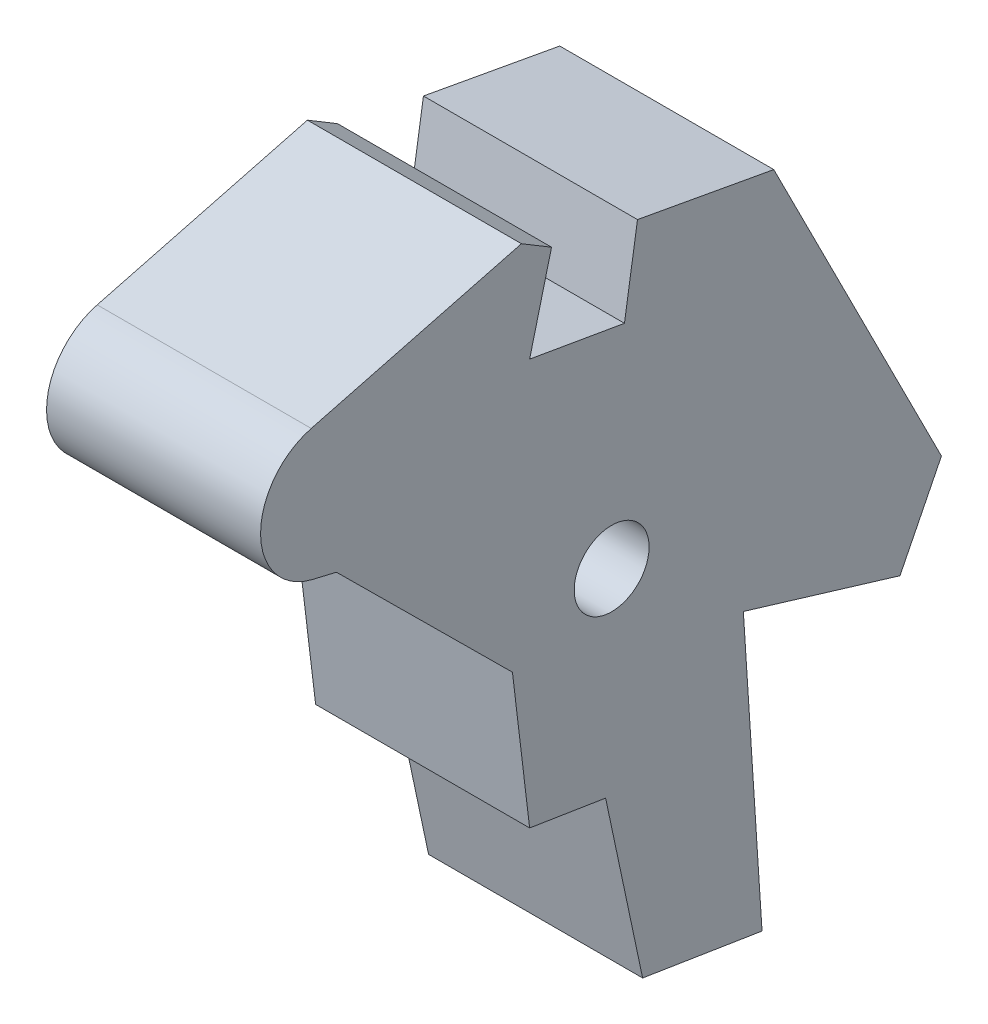
ISO-10303-21;
HEADER;
FILE_DESCRIPTION(('STEP AP214'),'2;1');
FILE_NAME('part.step','',(''),(''),'','','');
FILE_SCHEMA(('AUTOMOTIVE_DESIGN { 1 0 10303 214 1 1 1 1 }'));
ENDSEC;
DATA;
#1=APPLICATION_CONTEXT('core data for automotive mechanical design processes');
#2=APPLICATION_PROTOCOL_DEFINITION('international standard','automotive_design',2000,#1);
#3=PRODUCT_CONTEXT('',#1,'mechanical');
#4=PRODUCT('Part','Part','',(#3));
#5=PRODUCT_RELATED_PRODUCT_CATEGORY('part','',(#4));
#6=PRODUCT_DEFINITION_FORMATION('','',#4);
#7=PRODUCT_DEFINITION_CONTEXT('part definition',#1,'design');
#8=PRODUCT_DEFINITION('design','',#6,#7);
#9=PRODUCT_DEFINITION_SHAPE('','',#8);
#10=(LENGTH_UNIT() NAMED_UNIT(*) SI_UNIT(.MILLI.,.METRE.));
#11=(NAMED_UNIT(*) PLANE_ANGLE_UNIT() SI_UNIT($,.RADIAN.));
#12=(NAMED_UNIT(*) SI_UNIT($,.STERADIAN.) SOLID_ANGLE_UNIT());
#13=UNCERTAINTY_MEASURE_WITH_UNIT(LENGTH_MEASURE(1.E-05),#10,'distance_accuracy_value','');
#14=(GEOMETRIC_REPRESENTATION_CONTEXT(3) GLOBAL_UNCERTAINTY_ASSIGNED_CONTEXT((#13)) GLOBAL_UNIT_ASSIGNED_CONTEXT((#10,
#11,#12)) REPRESENTATION_CONTEXT('',''));
#15=CARTESIAN_POINT('',(0.,0.,0.));
#16=DIRECTION('',(0.,0.,1.));
#17=DIRECTION('',(1.,0.,0.));
#18=AXIS2_PLACEMENT_3D('',#15,#16,#17);
#19=CARTESIAN_POINT('',(6.,11.5482949787272,15.8837198712041));
#20=DIRECTION('',(1.,0.,0.));
#21=DIRECTION('',(0.,0.,-1.));
#22=AXIS2_PLACEMENT_3D('',#19,#20,#21);
#23=PLANE('',#22);
#24=CARTESIAN_POINT('',(6.,11.5482949787272,15.8837198712041));
#25=DIRECTION('',(1.,0.,0.));
#26=DIRECTION('',(0.,0.,-1.));
#27=AXIS2_PLACEMENT_3D('',#24,#25,#26);
#28=CIRCLE('',#27,3.8);
#29=CARTESIAN_POINT('',(6.,15.2250597478379,16.8436161325918));
#30=VERTEX_POINT('',#29);
#31=CARTESIAN_POINT('',(6.,7.84966433834525,16.7555750117106));
#32=VERTEX_POINT('',#31);
#33=EDGE_CURVE('E217',#30,#32,#28,.T.);
#34=ORIENTED_EDGE('',*,*,#33,.T.);
#35=DIRECTION('',(0.,-0.229435563291186,-0.973323852732099));
#36=VECTOR('',#35,1.);
#37=CARTESIAN_POINT('',(6.,7.84966433834525,16.7555750117106));
#38=LINE('',#37,#36);
#39=CARTESIAN_POINT('',(6.,7.53780659305625,15.4325953576636));
#40=VERTEX_POINT('',#39);
#41=EDGE_CURVE('E120',#32,#40,#38,.T.);
#42=ORIENTED_EDGE('',*,*,#41,.T.);
#43=DIRECTION('',(0.,-0.704199146911368,-0.710002508086628));
#44=VECTOR('',#43,1.);
#45=CARTESIAN_POINT('',(6.,7.53780659305625,15.4325953576636));
#46=LINE('',#45,#44);
#47=CARTESIAN_POINT('',(6.,-2.25101302616688,5.56310529744524));
#48=VERTEX_POINT('',#47);
#49=EDGE_CURVE('E259',#40,#48,#46,.T.);
#50=ORIENTED_EDGE('',*,*,#49,.T.);
#51=DIRECTION('',(0.,-0.992896070385912,-0.118984845304827));
#52=VECTOR('',#51,1.);
#53=CARTESIAN_POINT('',(6.,-2.25101302616688,5.56310529744524));
#54=LINE('',#53,#52);
#55=CARTESIAN_POINT('',(6.,-10.2975694173018,4.59883693543668));
#56=VERTEX_POINT('',#55);
#57=EDGE_CURVE('E278',#48,#56,#54,.T.);
#58=ORIENTED_EDGE('',*,*,#57,.T.);
#59=DIRECTION('',(0.,-0.157580761137786,-0.987506103130121));
#60=VECTOR('',#59,1.);
#61=CARTESIAN_POINT('',(6.,-10.2975694173018,4.59883693543668));
#62=LINE('',#61,#60);
#63=CARTESIAN_POINT('',(6.,-10.9774025682372,0.338549189574812));
#64=VERTEX_POINT('',#63);
#65=EDGE_CURVE('E275',#56,#64,#62,.T.);
#66=ORIENTED_EDGE('',*,*,#65,.T.);
#67=DIRECTION('',(0.,-0.978180845730438,-0.207755223871951));
#68=VECTOR('',#67,1.);
#69=CARTESIAN_POINT('',(6.,-10.9774025682372,0.338549189574812));
#70=LINE('',#69,#68);
#71=CARTESIAN_POINT('',(6.,-20.7506842257561,-1.73719204742035));
#72=VERTEX_POINT('',#71);
#73=EDGE_CURVE('E277',#64,#72,#70,.T.);
#74=ORIENTED_EDGE('',*,*,#73,.T.);
#75=DIRECTION('',(0.,-0.157580761137786,-0.98750610313012));
#76=VECTOR('',#75,1.);
#77=CARTESIAN_POINT('',(6.,-20.7506842257561,-1.73719204742035));
#78=LINE('',#77,#76);
#79=CARTESIAN_POINT('',(6.,-21.8189770940916,-8.43182735565568));
#80=VERTEX_POINT('',#79);
#81=EDGE_CURVE('E280',#72,#80,#78,.T.);
#82=ORIENTED_EDGE('',*,*,#81,.T.);
#83=DIRECTION('',(0.,0.997870415721973,0.0652275511333734));
#84=VECTOR('',#83,1.);
#85=CARTESIAN_POINT('',(6.,-21.8189770940916,-8.43182735565568));
#86=LINE('',#85,#84);
#87=CARTESIAN_POINT('',(6.,-5.77780276998713,-7.38326784133453));
#88=VERTEX_POINT('',#87);
#89=EDGE_CURVE('E286',#80,#88,#86,.T.);
#90=ORIENTED_EDGE('',*,*,#89,.T.);
#91=DIRECTION('',(0.,-0.289389501276324,-0.957211427298609));
#92=VECTOR('',#91,1.);
#93=CARTESIAN_POINT('',(6.,-5.77780276998713,-7.38326784133453));
#94=LINE('',#93,#92);
#95=CARTESIAN_POINT('',(6.,-8.43294422336665,-16.1656588025129));
#96=VERTEX_POINT('',#95);
#97=EDGE_CURVE('E288',#88,#96,#94,.T.);
#98=ORIENTED_EDGE('',*,*,#97,.T.);
#99=DIRECTION('',(0.,0.894427190999914,-0.447213595499961));
#100=VECTOR('',#99,1.);
#101=CARTESIAN_POINT('',(6.,-8.43294422336665,-16.1656588025129));
#102=LINE('',#101,#100);
#103=CARTESIAN_POINT('',(6.,-3.78275455297007,-18.4907536377112));
#104=VERTEX_POINT('',#103);
#105=EDGE_CURVE('E290',#96,#104,#102,.T.);
#106=ORIENTED_EDGE('',*,*,#105,.T.);
#107=DIRECTION('',(0.,0.892585662901264,0.450877848627663));
#108=VECTOR('',#107,1.);
#109=CARTESIAN_POINT('',(6.,14.8272375378383,-9.09016213637799));
#110=LINE('',#109,#108);
#111=CARTESIAN_POINT('',(6.,14.8272375378383,-9.09016213637799));
#112=VERTEX_POINT('',#111);
#113=EDGE_CURVE('E292',#104,#112,#110,.T.);
#114=ORIENTED_EDGE('',*,*,#113,.T.);
#115=DIRECTION('',(0.,0.179313157800738,0.98379204684706));
#116=VECTOR('',#115,1.);
#117=CARTESIAN_POINT('',(6.,16.2201449465328,-1.44805016046392));
#118=LINE('',#117,#116);
#119=CARTESIAN_POINT('',(6.,16.2201449465328,-1.44805016046392));
#120=VERTEX_POINT('',#119);
#121=EDGE_CURVE('E294',#112,#120,#118,.T.);
#122=ORIENTED_EDGE('',*,*,#121,.T.);
#123=DIRECTION('',(0.,-0.988036947940971,0.154217345015048));
#124=VECTOR('',#123,1.);
#125=CARTESIAN_POINT('',(6.,11.5482949787272,-0.718846359082742));
#126=LINE('',#125,#124);
#127=CARTESIAN_POINT('',(6.,11.5482949787272,-0.718846359082742));
#128=VERTEX_POINT('',#127);
#129=EDGE_CURVE('E296',#120,#128,#126,.T.);
#130=ORIENTED_EDGE('',*,*,#129,.T.);
#131=DIRECTION('',(0.,0.170199910900748,0.985409554616444));
#132=VECTOR('',#131,1.);
#133=CARTESIAN_POINT('',(6.,11.5482949787272,-0.718846359082742));
#134=LINE('',#133,#132);
#135=CARTESIAN_POINT('',(6.,12.4667650896426,4.59883693543668));
#136=VERTEX_POINT('',#135);
#137=EDGE_CURVE('E166',#128,#136,#134,.T.);
#138=ORIENTED_EDGE('',*,*,#137,.T.);
#139=DIRECTION('',(0.,0.969015390372987,-0.247000350648106));
#140=VECTOR('',#139,1.);
#141=CARTESIAN_POINT('',(6.,17.2874663476256,3.37004850449828));
#142=LINE('',#141,#140);
#143=CARTESIAN_POINT('',(6.,17.2874663476256,3.37004850449828));
#144=VERTEX_POINT('',#143);
#145=EDGE_CURVE('E160',#136,#144,#142,.T.);
#146=ORIENTED_EDGE('',*,*,#145,.T.);
#147=DIRECTION('',(0.,0.515048017006709,0.857161326809287));
#148=VECTOR('',#147,1.);
#149=CARTESIAN_POINT('',(6.,17.2874663476256,3.37004850449828));
#150=LINE('',#149,#148);
#151=CARTESIAN_POINT('',(6.,18.3018730775652,5.05826045726451));
#152=VERTEX_POINT('',#151);
#153=EDGE_CURVE('E164',#144,#152,#150,.T.);
#154=ORIENTED_EDGE('',*,*,#153,.T.);
#155=DIRECTION('',(0.,-0.252604279312563,0.96756967608177));
#156=VECTOR('',#155,1.);
#157=CARTESIAN_POINT('',(6.,15.2250597478379,16.8436161325918));
#158=LINE('',#157,#156);
#159=EDGE_CURVE('E50',#152,#30,#158,.T.);
#160=ORIENTED_EDGE('',*,*,#159,.T.);
#161=EDGE_LOOP('',(#34,#42,#50,#58,#66,#74,#82,#90,#98,#106,#114,#122,#130,#138,#146,#154,#160));
#162=FACE_BOUND('',#161,.T.);
#163=CARTESIAN_POINT('',(6.,0.,0.));
#164=DIRECTION('',(1.,0.,0.));
#165=DIRECTION('',(0.,0.,-1.));
#166=AXIS2_PLACEMENT_3D('',#163,#164,#165);
#167=CIRCLE('',#166,2.1);
#168=CARTESIAN_POINT('',(6.,0.,-2.1));
#169=VERTEX_POINT('',#168);
#170=EDGE_CURVE('E188',#169,#169,#167,.T.);
#171=ORIENTED_EDGE('',*,*,#170,.F.);
#172=EDGE_LOOP('',(#171));
#173=FACE_BOUND('',#172,.T.);
#174=ADVANCED_FACE('F33',(#162,#173),#23,.T.);
#175=CARTESIAN_POINT('',(-6.,11.5482949787272,15.8837198712041));
#176=DIRECTION('',(1.,0.,0.));
#177=DIRECTION('',(0.,0.,-1.));
#178=AXIS2_PLACEMENT_3D('',#175,#176,#177);
#179=PLANE('',#178);
#180=CARTESIAN_POINT('',(-6.,11.5482949787272,15.8837198712041));
#181=DIRECTION('',(1.,0.,0.));
#182=DIRECTION('',(0.,0.,-1.));
#183=AXIS2_PLACEMENT_3D('',#180,#181,#182);
#184=CIRCLE('',#183,3.8);
#185=CARTESIAN_POINT('',(-6.,15.2250597478379,16.8436161325918));
#186=VERTEX_POINT('',#185);
#187=CARTESIAN_POINT('',(-6.,7.84966433834525,16.7555750117106));
#188=VERTEX_POINT('',#187);
#189=EDGE_CURVE('E184',#186,#188,#184,.T.);
#190=ORIENTED_EDGE('',*,*,#189,.F.);
#191=DIRECTION('',(0.,-0.252604279312563,0.96756967608177));
#192=VECTOR('',#191,1.);
#193=CARTESIAN_POINT('',(-6.,15.2250597478379,16.8436161325918));
#194=LINE('',#193,#192);
#195=CARTESIAN_POINT('',(-6.,18.3018730775652,5.05826045726451));
#196=VERTEX_POINT('',#195);
#197=EDGE_CURVE('E112',#196,#186,#194,.T.);
#198=ORIENTED_EDGE('',*,*,#197,.F.);
#199=DIRECTION('',(0.,0.515048017006709,0.857161326809287));
#200=VECTOR('',#199,1.);
#201=CARTESIAN_POINT('',(-6.,17.2874663476256,3.37004850449828));
#202=LINE('',#201,#200);
#203=CARTESIAN_POINT('',(-6.,17.2874663476256,3.37004850449828));
#204=VERTEX_POINT('',#203);
#205=EDGE_CURVE('E106',#204,#196,#202,.T.);
#206=ORIENTED_EDGE('',*,*,#205,.F.);
#207=DIRECTION('',(0.,0.969015390372987,-0.247000350648106));
#208=VECTOR('',#207,1.);
#209=CARTESIAN_POINT('',(-6.,17.2874663476256,3.37004850449828));
#210=LINE('',#209,#208);
#211=CARTESIAN_POINT('',(-6.,12.4667650896426,4.59883693543668));
#212=VERTEX_POINT('',#211);
#213=EDGE_CURVE('E174',#212,#204,#210,.T.);
#214=ORIENTED_EDGE('',*,*,#213,.F.);
#215=DIRECTION('',(0.,0.170199910900748,0.985409554616444));
#216=VECTOR('',#215,1.);
#217=CARTESIAN_POINT('',(-6.,11.5482949787272,-0.718846359082742));
#218=LINE('',#217,#216);
#219=CARTESIAN_POINT('',(-6.,11.5482949787272,-0.718846359082742));
#220=VERTEX_POINT('',#219);
#221=EDGE_CURVE('E212',#220,#212,#218,.T.);
#222=ORIENTED_EDGE('',*,*,#221,.F.);
#223=DIRECTION('',(0.,-0.988036947940971,0.154217345015048));
#224=VECTOR('',#223,1.);
#225=CARTESIAN_POINT('',(-6.,11.5482949787272,-0.718846359082742));
#226=LINE('',#225,#224);
#227=CARTESIAN_POINT('',(-6.,16.2201449465328,-1.44805016046392));
#228=VERTEX_POINT('',#227);
#229=EDGE_CURVE('E210',#228,#220,#226,.T.);
#230=ORIENTED_EDGE('',*,*,#229,.F.);
#231=DIRECTION('',(0.,0.179313157800738,0.98379204684706));
#232=VECTOR('',#231,1.);
#233=CARTESIAN_POINT('',(-6.,16.2201449465328,-1.44805016046392));
#234=LINE('',#233,#232);
#235=CARTESIAN_POINT('',(-6.,14.8272375378383,-9.09016213637799));
#236=VERTEX_POINT('',#235);
#237=EDGE_CURVE('E208',#236,#228,#234,.T.);
#238=ORIENTED_EDGE('',*,*,#237,.F.);
#239=DIRECTION('',(0.,0.892585662901264,0.450877848627663));
#240=VECTOR('',#239,1.);
#241=CARTESIAN_POINT('',(-6.,14.8272375378383,-9.09016213637799));
#242=LINE('',#241,#240);
#243=CARTESIAN_POINT('',(-6.,-3.78275455297007,-18.4907536377112));
#244=VERTEX_POINT('',#243);
#245=EDGE_CURVE('E206',#244,#236,#242,.T.);
#246=ORIENTED_EDGE('',*,*,#245,.F.);
#247=DIRECTION('',(0.,0.894427190999914,-0.447213595499961));
#248=VECTOR('',#247,1.);
#249=CARTESIAN_POINT('',(-6.,-8.43294422336665,-16.1656588025129));
#250=LINE('',#249,#248);
#251=CARTESIAN_POINT('',(-6.,-8.43294422336665,-16.1656588025129));
#252=VERTEX_POINT('',#251);
#253=EDGE_CURVE('E204',#252,#244,#250,.T.);
#254=ORIENTED_EDGE('',*,*,#253,.F.);
#255=DIRECTION('',(0.,-0.289389501276324,-0.957211427298609));
#256=VECTOR('',#255,1.);
#257=CARTESIAN_POINT('',(-6.,-5.77780276998713,-7.38326784133453));
#258=LINE('',#257,#256);
#259=CARTESIAN_POINT('',(-6.,-5.77780276998713,-7.38326784133453));
#260=VERTEX_POINT('',#259);
#261=EDGE_CURVE('E202',#260,#252,#258,.T.);
#262=ORIENTED_EDGE('',*,*,#261,.F.);
#263=DIRECTION('',(0.,0.997870415721973,0.0652275511333734));
#264=VECTOR('',#263,1.);
#265=CARTESIAN_POINT('',(-6.,-21.8189770940916,-8.43182735565568));
#266=LINE('',#265,#264);
#267=CARTESIAN_POINT('',(-6.,-21.8189770940916,-8.43182735565568));
#268=VERTEX_POINT('',#267);
#269=EDGE_CURVE('E200',#268,#260,#266,.T.);
#270=ORIENTED_EDGE('',*,*,#269,.F.);
#271=DIRECTION('',(0.,-0.157580761137786,-0.98750610313012));
#272=VECTOR('',#271,1.);
#273=CARTESIAN_POINT('',(-6.,-20.7506842257561,-1.73719204742035));
#274=LINE('',#273,#272);
#275=CARTESIAN_POINT('',(-6.,-20.7506842257561,-1.73719204742035));
#276=VERTEX_POINT('',#275);
#277=EDGE_CURVE('E198',#276,#268,#274,.T.);
#278=ORIENTED_EDGE('',*,*,#277,.F.);
#279=DIRECTION('',(0.,-0.978180845730438,-0.207755223871951));
#280=VECTOR('',#279,1.);
#281=CARTESIAN_POINT('',(-6.,-10.9774025682372,0.338549189574812));
#282=LINE('',#281,#280);
#283=CARTESIAN_POINT('',(-6.,-10.9774025682372,0.338549189574812));
#284=VERTEX_POINT('',#283);
#285=EDGE_CURVE('E196',#284,#276,#282,.T.);
#286=ORIENTED_EDGE('',*,*,#285,.F.);
#287=DIRECTION('',(0.,-0.157580761137786,-0.987506103130121));
#288=VECTOR('',#287,1.);
#289=CARTESIAN_POINT('',(-6.,-10.2975694173018,4.59883693543668));
#290=LINE('',#289,#288);
#291=CARTESIAN_POINT('',(-6.,-10.2975694173018,4.59883693543668));
#292=VERTEX_POINT('',#291);
#293=EDGE_CURVE('E194',#292,#284,#290,.T.);
#294=ORIENTED_EDGE('',*,*,#293,.F.);
#295=DIRECTION('',(0.,-0.992896070385912,-0.118984845304827));
#296=VECTOR('',#295,1.);
#297=CARTESIAN_POINT('',(-6.,-2.25101302616688,5.56310529744524));
#298=LINE('',#297,#296);
#299=CARTESIAN_POINT('',(-6.,-2.25101302616688,5.56310529744524));
#300=VERTEX_POINT('',#299);
#301=EDGE_CURVE('E192',#300,#292,#298,.T.);
#302=ORIENTED_EDGE('',*,*,#301,.F.);
#303=DIRECTION('',(0.,-0.704199146911368,-0.710002508086628));
#304=VECTOR('',#303,1.);
#305=CARTESIAN_POINT('',(-6.,7.53780659305625,15.4325953576636));
#306=LINE('',#305,#304);
#307=CARTESIAN_POINT('',(-6.,7.53780659305625,15.4325953576636));
#308=VERTEX_POINT('',#307);
#309=EDGE_CURVE('E190',#308,#300,#306,.T.);
#310=ORIENTED_EDGE('',*,*,#309,.F.);
#311=DIRECTION('',(0.,-0.229435563291186,-0.973323852732099));
#312=VECTOR('',#311,1.);
#313=CARTESIAN_POINT('',(-6.,7.84966433834525,16.7555750117106));
#314=LINE('',#313,#312);
#315=EDGE_CURVE('E187',#188,#308,#314,.T.);
#316=ORIENTED_EDGE('',*,*,#315,.F.);
#317=EDGE_LOOP('',(#190,#198,#206,#214,#222,#230,#238,#246,#254,#262,#270,#278,#286,#294,#302,
#310,#316));
#318=FACE_BOUND('',#317,.T.);
#319=CARTESIAN_POINT('',(-6.,0.,0.));
#320=DIRECTION('',(1.,0.,0.));
#321=DIRECTION('',(0.,0.,-1.));
#322=AXIS2_PLACEMENT_3D('',#319,#320,#321);
#323=CIRCLE('',#322,2.1);
#324=CARTESIAN_POINT('',(-6.,0.,-2.1));
#325=VERTEX_POINT('',#324);
#326=EDGE_CURVE('E508',#325,#325,#323,.T.);
#327=ORIENTED_EDGE('',*,*,#326,.T.);
#328=EDGE_LOOP('',(#327));
#329=FACE_BOUND('',#328,.T.);
#330=ADVANCED_FACE('F263',(#318,#329),#179,.F.);
#331=CARTESIAN_POINT('',(6.,11.5482949787272,15.8837198712041));
#332=DIRECTION('',(-1.,0.,0.));
#333=DIRECTION('',(0.,0.,1.));
#334=AXIS2_PLACEMENT_3D('',#331,#332,#333);
#335=CYLINDRICAL_SURFACE('',#334,3.8);
#336=ORIENTED_EDGE('',*,*,#189,.T.);
#337=DIRECTION('',(-1.,0.,0.));
#338=VECTOR('',#337,1.);
#339=CARTESIAN_POINT('',(6.,7.84966433834525,16.7555750117106));
#340=LINE('',#339,#338);
#341=EDGE_CURVE('E11',#32,#188,#340,.T.);
#342=ORIENTED_EDGE('',*,*,#341,.F.);
#343=ORIENTED_EDGE('',*,*,#33,.F.);
#344=DIRECTION('',(-1.,0.,0.));
#345=VECTOR('',#344,1.);
#346=CARTESIAN_POINT('',(6.,15.2250597478379,16.8436161325918));
#347=LINE('',#346,#345);
#348=EDGE_CURVE('E180',#30,#186,#347,.T.);
#349=ORIENTED_EDGE('',*,*,#348,.T.);
#350=EDGE_LOOP('',(#336,#342,#343,#349));
#351=FACE_BOUND('',#350,.T.);
#352=ADVANCED_FACE('F35',(#351),#335,.T.);
#353=CARTESIAN_POINT('',(6.,7.84966433834525,16.7555750117106));
#354=DIRECTION('',(0.,0.973323852732099,-0.229435563291186));
#355=DIRECTION('',(0.,0.229435563291186,0.973323852732099));
#356=AXIS2_PLACEMENT_3D('',#353,#354,#355);
#357=PLANE('',#356);
#358=ORIENTED_EDGE('',*,*,#315,.T.);
#359=DIRECTION('',(-1.,0.,0.));
#360=VECTOR('',#359,1.);
#361=CARTESIAN_POINT('',(6.,7.53780659305625,15.4325953576636));
#362=LINE('',#361,#360);
#363=EDGE_CURVE('E42',#40,#308,#362,.T.);
#364=ORIENTED_EDGE('',*,*,#363,.F.);
#365=ORIENTED_EDGE('',*,*,#41,.F.);
#366=ORIENTED_EDGE('',*,*,#341,.T.);
#367=EDGE_LOOP('',(#358,#364,#365,#366));
#368=FACE_BOUND('',#367,.T.);
#369=ADVANCED_FACE('F330',(#368),#357,.F.);
#370=CARTESIAN_POINT('',(6.,7.53780659305625,15.4325953576636));
#371=DIRECTION('',(0.,0.710002508086628,-0.704199146911368));
#372=DIRECTION('',(0.,0.704199146911368,0.710002508086628));
#373=AXIS2_PLACEMENT_3D('',#370,#371,#372);
#374=PLANE('',#373);
#375=ORIENTED_EDGE('',*,*,#309,.T.);
#376=DIRECTION('',(-1.,0.,0.));
#377=VECTOR('',#376,1.);
#378=CARTESIAN_POINT('',(6.,-2.25101302616688,5.56310529744524));
#379=LINE('',#378,#377);
#380=EDGE_CURVE('E251',#48,#300,#379,.T.);
#381=ORIENTED_EDGE('',*,*,#380,.F.);
#382=ORIENTED_EDGE('',*,*,#49,.F.);
#383=ORIENTED_EDGE('',*,*,#363,.T.);
#384=EDGE_LOOP('',(#375,#381,#382,#383));
#385=FACE_BOUND('',#384,.T.);
#386=ADVANCED_FACE('F257',(#385),#374,.F.);
#387=CARTESIAN_POINT('',(6.,-2.25101302616688,5.56310529744524));
#388=DIRECTION('',(0.,0.118984845304827,-0.992896070385912));
#389=DIRECTION('',(0.,0.992896070385912,0.118984845304827));
#390=AXIS2_PLACEMENT_3D('',#387,#388,#389);
#391=PLANE('',#390);
#392=ORIENTED_EDGE('',*,*,#301,.T.);
#393=DIRECTION('',(-1.,0.,0.));
#394=VECTOR('',#393,1.);
#395=CARTESIAN_POINT('',(6.,-10.2975694173018,4.59883693543668));
#396=LINE('',#395,#394);
#397=EDGE_CURVE('E248',#56,#292,#396,.T.);
#398=ORIENTED_EDGE('',*,*,#397,.F.);
#399=ORIENTED_EDGE('',*,*,#57,.F.);
#400=ORIENTED_EDGE('',*,*,#380,.T.);
#401=EDGE_LOOP('',(#392,#398,#399,#400));
#402=FACE_BOUND('',#401,.T.);
#403=ADVANCED_FACE('F269',(#402),#391,.F.);
#404=CARTESIAN_POINT('',(6.,-10.2975694173018,4.59883693543668));
#405=DIRECTION('',(0.,0.98750610313012,-0.157580761137786));
#406=DIRECTION('',(0.,0.157580761137786,0.987506103130121));
#407=AXIS2_PLACEMENT_3D('',#404,#405,#406);
#408=PLANE('',#407);
#409=ORIENTED_EDGE('',*,*,#293,.T.);
#410=DIRECTION('',(-1.,0.,0.));
#411=VECTOR('',#410,1.);
#412=CARTESIAN_POINT('',(6.,-10.9774025682372,0.338549189574812));
#413=LINE('',#412,#411);
#414=EDGE_CURVE('E245',#64,#284,#413,.T.);
#415=ORIENTED_EDGE('',*,*,#414,.F.);
#416=ORIENTED_EDGE('',*,*,#65,.F.);
#417=ORIENTED_EDGE('',*,*,#397,.T.);
#418=EDGE_LOOP('',(#409,#415,#416,#417));
#419=FACE_BOUND('',#418,.T.);
#420=ADVANCED_FACE('F273',(#419),#408,.F.);
#421=CARTESIAN_POINT('',(6.,-10.9774025682372,0.338549189574812));
#422=DIRECTION('',(0.,0.207755223871951,-0.978180845730438));
#423=DIRECTION('',(0.,0.978180845730438,0.207755223871951));
#424=AXIS2_PLACEMENT_3D('',#421,#422,#423);
#425=PLANE('',#424);
#426=ORIENTED_EDGE('',*,*,#285,.T.);
#427=DIRECTION('',(-1.,0.,0.));
#428=VECTOR('',#427,1.);
#429=CARTESIAN_POINT('',(6.,-20.7506842257561,-1.73719204742035));
#430=LINE('',#429,#428);
#431=EDGE_CURVE('E242',#72,#276,#430,.T.);
#432=ORIENTED_EDGE('',*,*,#431,.F.);
#433=ORIENTED_EDGE('',*,*,#73,.F.);
#434=ORIENTED_EDGE('',*,*,#414,.T.);
#435=EDGE_LOOP('',(#426,#432,#433,#434));
#436=FACE_BOUND('',#435,.T.);
#437=ADVANCED_FACE('F343',(#436),#425,.F.);
#438=CARTESIAN_POINT('',(6.,-20.7506842257561,-1.73719204742035));
#439=DIRECTION('',(0.,0.98750610313012,-0.157580761137786));
#440=DIRECTION('',(0.,0.157580761137786,0.98750610313012));
#441=AXIS2_PLACEMENT_3D('',#438,#439,#440);
#442=PLANE('',#441);
#443=ORIENTED_EDGE('',*,*,#277,.T.);
#444=DIRECTION('',(-1.,0.,0.));
#445=VECTOR('',#444,1.);
#446=CARTESIAN_POINT('',(6.,-21.8189770940916,-8.43182735565568));
#447=LINE('',#446,#445);
#448=EDGE_CURVE('E239',#80,#268,#447,.T.);
#449=ORIENTED_EDGE('',*,*,#448,.F.);
#450=ORIENTED_EDGE('',*,*,#81,.F.);
#451=ORIENTED_EDGE('',*,*,#431,.T.);
#452=EDGE_LOOP('',(#443,#449,#450,#451));
#453=FACE_BOUND('',#452,.T.);
#454=ADVANCED_FACE('F346',(#453),#442,.F.);
#455=CARTESIAN_POINT('',(6.,-21.8189770940916,-8.43182735565568));
#456=DIRECTION('',(0.,-0.0652275511333734,0.997870415721973));
#457=DIRECTION('',(0.,-0.997870415721973,-0.0652275511333734));
#458=AXIS2_PLACEMENT_3D('',#455,#456,#457);
#459=PLANE('',#458);
#460=ORIENTED_EDGE('',*,*,#269,.T.);
#461=DIRECTION('',(-1.,0.,0.));
#462=VECTOR('',#461,1.);
#463=CARTESIAN_POINT('',(6.,-5.77780276998713,-7.38326784133453));
#464=LINE('',#463,#462);
#465=EDGE_CURVE('E236',#88,#260,#464,.T.);
#466=ORIENTED_EDGE('',*,*,#465,.F.);
#467=ORIENTED_EDGE('',*,*,#89,.F.);
#468=ORIENTED_EDGE('',*,*,#448,.T.);
#469=EDGE_LOOP('',(#460,#466,#467,#468));
#470=FACE_BOUND('',#469,.T.);
#471=ADVANCED_FACE('F350',(#470),#459,.F.);
#472=CARTESIAN_POINT('',(6.,-5.77780276998713,-7.38326784133453));
#473=DIRECTION('',(0.,0.957211427298609,-0.289389501276324));
#474=DIRECTION('',(0.,0.289389501276324,0.957211427298609));
#475=AXIS2_PLACEMENT_3D('',#472,#473,#474);
#476=PLANE('',#475);
#477=ORIENTED_EDGE('',*,*,#261,.T.);
#478=DIRECTION('',(-1.,0.,0.));
#479=VECTOR('',#478,1.);
#480=CARTESIAN_POINT('',(6.,-8.43294422336665,-16.1656588025129));
#481=LINE('',#480,#479);
#482=EDGE_CURVE('E233',#96,#252,#481,.T.);
#483=ORIENTED_EDGE('',*,*,#482,.F.);
#484=ORIENTED_EDGE('',*,*,#97,.F.);
#485=ORIENTED_EDGE('',*,*,#465,.T.);
#486=EDGE_LOOP('',(#477,#483,#484,#485));
#487=FACE_BOUND('',#486,.T.);
#488=ADVANCED_FACE('F354',(#487),#476,.F.);
#489=CARTESIAN_POINT('',(6.,-8.43294422336665,-16.1656588025129));
#490=DIRECTION('',(0.,0.447213595499961,0.894427190999914));
#491=DIRECTION('',(0.,-0.894427190999915,0.447213595499961));
#492=AXIS2_PLACEMENT_3D('',#489,#490,#491);
#493=PLANE('',#492);
#494=ORIENTED_EDGE('',*,*,#253,.T.);
#495=DIRECTION('',(-1.,0.,0.));
#496=VECTOR('',#495,1.);
#497=CARTESIAN_POINT('',(6.,-3.78275455297007,-18.4907536377112));
#498=LINE('',#497,#496);
#499=EDGE_CURVE('E230',#104,#244,#498,.T.);
#500=ORIENTED_EDGE('',*,*,#499,.F.);
#501=ORIENTED_EDGE('',*,*,#105,.F.);
#502=ORIENTED_EDGE('',*,*,#482,.T.);
#503=EDGE_LOOP('',(#494,#500,#501,#502));
#504=FACE_BOUND('',#503,.T.);
#505=ADVANCED_FACE('F358',(#504),#493,.F.);
#506=CARTESIAN_POINT('',(6.,14.8272375378383,-9.09016213637799));
#507=DIRECTION('',(0.,-0.450877848627664,0.892585662901265));
#508=DIRECTION('',(0.,-0.892585662901265,-0.450877848627664));
#509=AXIS2_PLACEMENT_3D('',#506,#507,#508);
#510=PLANE('',#509);
#511=ORIENTED_EDGE('',*,*,#245,.T.);
#512=DIRECTION('',(-1.,0.,0.));
#513=VECTOR('',#512,1.);
#514=CARTESIAN_POINT('',(6.,14.8272375378383,-9.09016213637799));
#515=LINE('',#514,#513);
#516=EDGE_CURVE('E227',#112,#236,#515,.T.);
#517=ORIENTED_EDGE('',*,*,#516,.F.);
#518=ORIENTED_EDGE('',*,*,#113,.F.);
#519=ORIENTED_EDGE('',*,*,#499,.T.);
#520=EDGE_LOOP('',(#511,#517,#518,#519));
#521=FACE_BOUND('',#520,.T.);
#522=ADVANCED_FACE('F362',(#521),#510,.F.);
#523=CARTESIAN_POINT('',(6.,16.2201449465328,-1.44805016046392));
#524=DIRECTION('',(0.,-0.98379204684706,0.179313157800738));
#525=DIRECTION('',(0.,-0.179313157800738,-0.98379204684706));
#526=AXIS2_PLACEMENT_3D('',#523,#524,#525);
#527=PLANE('',#526);
#528=ORIENTED_EDGE('',*,*,#237,.T.);
#529=DIRECTION('',(-1.,0.,0.));
#530=VECTOR('',#529,1.);
#531=CARTESIAN_POINT('',(6.,16.2201449465328,-1.44805016046392));
#532=LINE('',#531,#530);
#533=EDGE_CURVE('E224',#120,#228,#532,.T.);
#534=ORIENTED_EDGE('',*,*,#533,.F.);
#535=ORIENTED_EDGE('',*,*,#121,.F.);
#536=ORIENTED_EDGE('',*,*,#516,.T.);
#537=EDGE_LOOP('',(#528,#534,#535,#536));
#538=FACE_BOUND('',#537,.T.);
#539=ADVANCED_FACE('F366',(#538),#527,.F.);
#540=CARTESIAN_POINT('',(6.,11.5482949787272,-0.718846359082742));
#541=DIRECTION('',(0.,-0.154217345015048,-0.988036947940971));
#542=DIRECTION('',(0.,0.988036947940972,-0.154217345015048));
#543=AXIS2_PLACEMENT_3D('',#540,#541,#542);
#544=PLANE('',#543);
#545=ORIENTED_EDGE('',*,*,#229,.T.);
#546=DIRECTION('',(-1.,0.,0.));
#547=VECTOR('',#546,1.);
#548=CARTESIAN_POINT('',(6.,11.5482949787272,-0.718846359082742));
#549=LINE('',#548,#547);
#550=EDGE_CURVE('E221',#128,#220,#549,.T.);
#551=ORIENTED_EDGE('',*,*,#550,.F.);
#552=ORIENTED_EDGE('',*,*,#129,.F.);
#553=ORIENTED_EDGE('',*,*,#533,.T.);
#554=EDGE_LOOP('',(#545,#551,#552,#553));
#555=FACE_BOUND('',#554,.T.);
#556=ADVANCED_FACE('F302',(#555),#544,.F.);
#557=CARTESIAN_POINT('',(6.,11.5482949787272,-0.718846359082742));
#558=DIRECTION('',(0.,-0.985409554616443,0.170199910900748));
#559=DIRECTION('',(0.,-0.170199910900748,-0.985409554616444));
#560=AXIS2_PLACEMENT_3D('',#557,#558,#559);
#561=PLANE('',#560);
#562=ORIENTED_EDGE('',*,*,#221,.T.);
#563=DIRECTION('',(-1.,0.,0.));
#564=VECTOR('',#563,1.);
#565=CARTESIAN_POINT('',(6.,12.4667650896426,4.59883693543668));
#566=LINE('',#565,#564);
#567=EDGE_CURVE('E175',#136,#212,#566,.T.);
#568=ORIENTED_EDGE('',*,*,#567,.F.);
#569=ORIENTED_EDGE('',*,*,#137,.F.);
#570=ORIENTED_EDGE('',*,*,#550,.T.);
#571=EDGE_LOOP('',(#562,#568,#569,#570));
#572=FACE_BOUND('',#571,.T.);
#573=ADVANCED_FACE('F306',(#572),#561,.F.);
#574=CARTESIAN_POINT('',(6.,17.2874663476256,3.37004850449828));
#575=DIRECTION('',(0.,0.247000350648106,0.969015390372987));
#576=DIRECTION('',(0.,-0.969015390372987,0.247000350648106));
#577=AXIS2_PLACEMENT_3D('',#574,#575,#576);
#578=PLANE('',#577);
#579=ORIENTED_EDGE('',*,*,#213,.T.);
#580=DIRECTION('',(-1.,0.,0.));
#581=VECTOR('',#580,1.);
#582=CARTESIAN_POINT('',(6.,17.2874663476256,3.37004850449828));
#583=LINE('',#582,#581);
#584=EDGE_CURVE('E171',#144,#204,#583,.T.);
#585=ORIENTED_EDGE('',*,*,#584,.F.);
#586=ORIENTED_EDGE('',*,*,#145,.F.);
#587=ORIENTED_EDGE('',*,*,#567,.T.);
#588=EDGE_LOOP('',(#579,#585,#586,#587));
#589=FACE_BOUND('',#588,.T.);
#590=ADVANCED_FACE('F172',(#589),#578,.F.);
#591=CARTESIAN_POINT('',(6.,17.2874663476256,3.37004850449828));
#592=DIRECTION('',(0.,-0.857161326809287,0.515048017006709));
#593=DIRECTION('',(0.,-0.515048017006709,-0.857161326809287));
#594=AXIS2_PLACEMENT_3D('',#591,#592,#593);
#595=PLANE('',#594);
#596=ORIENTED_EDGE('',*,*,#205,.T.);
#597=DIRECTION('',(-1.,0.,0.));
#598=VECTOR('',#597,1.);
#599=CARTESIAN_POINT('',(6.,18.3018730775652,5.05826045726451));
#600=LINE('',#599,#598);
#601=EDGE_CURVE('E176',#152,#196,#600,.T.);
#602=ORIENTED_EDGE('',*,*,#601,.F.);
#603=ORIENTED_EDGE('',*,*,#153,.F.);
#604=ORIENTED_EDGE('',*,*,#584,.T.);
#605=EDGE_LOOP('',(#596,#602,#603,#604));
#606=FACE_BOUND('',#605,.T.);
#607=ADVANCED_FACE('F178',(#606),#595,.F.);
#608=CARTESIAN_POINT('',(6.,15.2250597478379,16.8436161325918));
#609=DIRECTION('',(0.,-0.96756967608177,-0.252604279312563));
#610=DIRECTION('',(0.,0.252604279312563,-0.96756967608177));
#611=AXIS2_PLACEMENT_3D('',#608,#609,#610);
#612=PLANE('',#611);
#613=ORIENTED_EDGE('',*,*,#197,.T.);
#614=ORIENTED_EDGE('',*,*,#348,.F.);
#615=ORIENTED_EDGE('',*,*,#159,.F.);
#616=ORIENTED_EDGE('',*,*,#601,.T.);
#617=EDGE_LOOP('',(#613,#614,#615,#616));
#618=FACE_BOUND('',#617,.T.);
#619=ADVANCED_FACE('F310',(#618),#612,.F.);
#620=CARTESIAN_POINT('',(6.,0.,0.));
#621=DIRECTION('',(-1.,0.,0.));
#622=DIRECTION('',(0.,0.,1.));
#623=AXIS2_PLACEMENT_3D('',#620,#621,#622);
#624=CYLINDRICAL_SURFACE('',#623,2.1);
#625=ORIENTED_EDGE('',*,*,#170,.T.);
#626=EDGE_LOOP('',(#625));
#627=FACE_BOUND('',#626,.T.);
#628=ORIENTED_EDGE('',*,*,#326,.F.);
#629=EDGE_LOOP('',(#628));
#630=FACE_BOUND('',#629,.T.);
#631=ADVANCED_FACE('F312',(#627,#630),#624,.F.);
#632=CLOSED_SHELL('',(#174,#330,#352,#369,#386,#403,#420,#437,#454,#471,#488,#505,#522,#539,
#556,#573,#590,#607,#619,#631));
#633=MANIFOLD_SOLID_BREP('B2',#632);
#634=ADVANCED_BREP_SHAPE_REPRESENTATION('',(#18,#633),#14);
#635=SHAPE_DEFINITION_REPRESENTATION(#9,#634);
ENDSEC;
END-ISO-10303-21;
